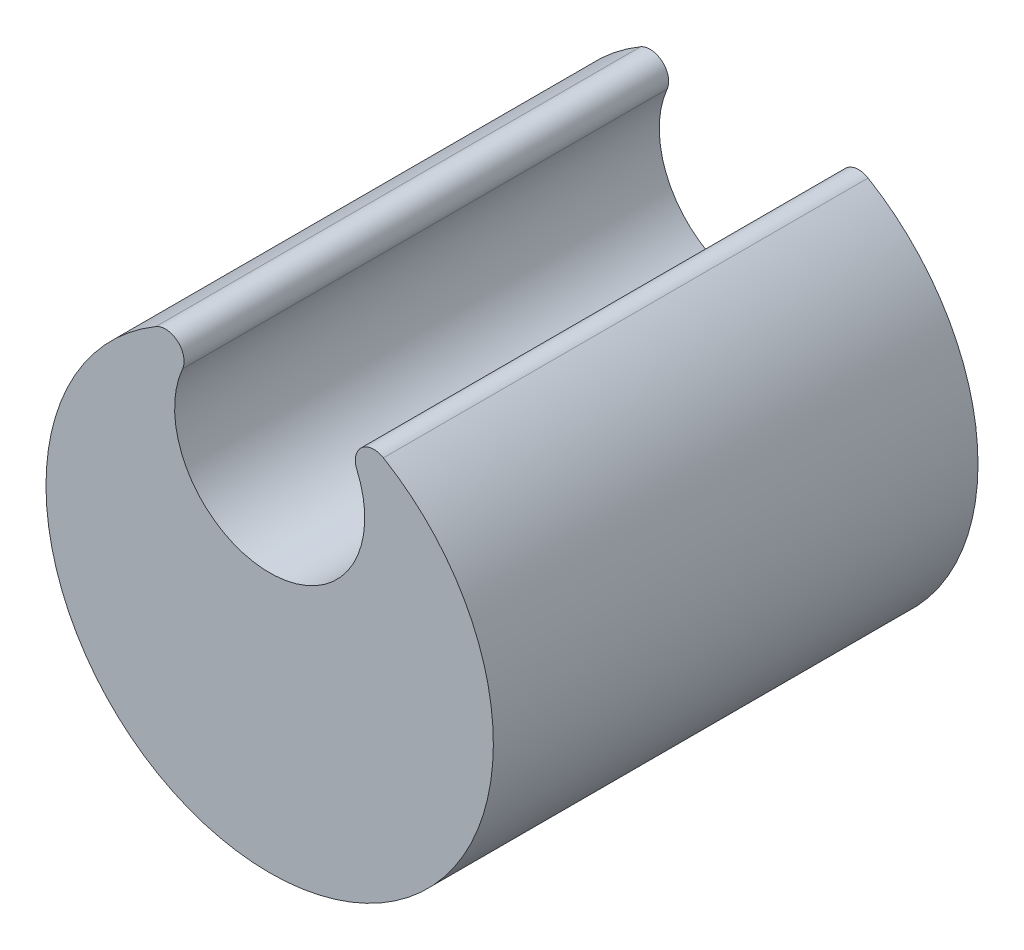
ISO-10303-21;
HEADER;
FILE_DESCRIPTION(('STEP AP214'),'2;1');
FILE_NAME('part.step','',(''),(''),'','','');
FILE_SCHEMA(('AUTOMOTIVE_DESIGN { 1 0 10303 214 1 1 1 1 }'));
ENDSEC;
DATA;
#1=APPLICATION_CONTEXT('core data for automotive mechanical design processes');
#2=APPLICATION_PROTOCOL_DEFINITION('international standard','automotive_design',2000,#1);
#3=PRODUCT_CONTEXT('',#1,'mechanical');
#4=PRODUCT('Part','Part','',(#3));
#5=PRODUCT_RELATED_PRODUCT_CATEGORY('part','',(#4));
#6=PRODUCT_DEFINITION_FORMATION('','',#4);
#7=PRODUCT_DEFINITION_CONTEXT('part definition',#1,'design');
#8=PRODUCT_DEFINITION('design','',#6,#7);
#9=PRODUCT_DEFINITION_SHAPE('','',#8);
#10=(LENGTH_UNIT() NAMED_UNIT(*) SI_UNIT(.MILLI.,.METRE.));
#11=(NAMED_UNIT(*) PLANE_ANGLE_UNIT() SI_UNIT($,.RADIAN.));
#12=(NAMED_UNIT(*) SI_UNIT($,.STERADIAN.) SOLID_ANGLE_UNIT());
#13=UNCERTAINTY_MEASURE_WITH_UNIT(LENGTH_MEASURE(1.E-05),#10,'distance_accuracy_value','');
#14=(GEOMETRIC_REPRESENTATION_CONTEXT(3) GLOBAL_UNCERTAINTY_ASSIGNED_CONTEXT((#13)) GLOBAL_UNIT_ASSIGNED_CONTEXT((#10,
#11,#12)) REPRESENTATION_CONTEXT('',''));
#15=CARTESIAN_POINT('',(0.,0.,0.));
#16=DIRECTION('',(0.,0.,1.));
#17=DIRECTION('',(1.,0.,0.));
#18=AXIS2_PLACEMENT_3D('',#15,#16,#17);
#19=CARTESIAN_POINT('',(0.,0.,13.));
#20=DIRECTION('',(0.,0.,-1.));
#21=DIRECTION('',(-1.,0.,0.));
#22=AXIS2_PLACEMENT_3D('',#19,#20,#21);
#23=CYLINDRICAL_SURFACE('',#22,6.);
#24=CARTESIAN_POINT('',(0.,0.,0.));
#25=DIRECTION('',(0.,0.,1.));
#26=DIRECTION('',(1.,0.,0.));
#27=AXIS2_PLACEMENT_3D('',#24,#25,#26);
#28=CIRCLE('',#27,6.);
#29=CARTESIAN_POINT('',(-3.05147827309755,5.16608946388016,0.));
#30=VERTEX_POINT('',#29);
#31=CARTESIAN_POINT('',(3.05147827309755,5.16608946388016,0.));
#32=VERTEX_POINT('',#31);
#33=EDGE_CURVE('E81',#30,#32,#28,.T.);
#34=ORIENTED_EDGE('',*,*,#33,.T.);
#35=DIRECTION('',(0.,0.,-1.));
#36=VECTOR('',#35,1.);
#37=CARTESIAN_POINT('',(3.05147827309755,5.16608946388016,13.));
#38=LINE('',#37,#36);
#39=CARTESIAN_POINT('',(3.05147827309755,5.16608946388016,13.));
#40=VERTEX_POINT('',#39);
#41=EDGE_CURVE('E51',#32,#40,#38,.F.);
#42=ORIENTED_EDGE('',*,*,#41,.T.);
#43=CARTESIAN_POINT('',(0.,0.,13.));
#44=DIRECTION('',(0.,0.,1.));
#45=DIRECTION('',(1.,0.,0.));
#46=AXIS2_PLACEMENT_3D('',#43,#44,#45);
#47=CIRCLE('',#46,6.);
#48=CARTESIAN_POINT('',(-3.05147827309755,5.16608946388016,13.));
#49=VERTEX_POINT('',#48);
#50=EDGE_CURVE('E96',#49,#40,#47,.T.);
#51=ORIENTED_EDGE('',*,*,#50,.F.);
#52=DIRECTION('',(0.,0.,-1.));
#53=VECTOR('',#52,1.);
#54=CARTESIAN_POINT('',(-3.05147827309755,5.16608946388016,13.));
#55=LINE('',#54,#53);
#56=EDGE_CURVE('E110',#49,#30,#55,.T.);
#57=ORIENTED_EDGE('',*,*,#56,.T.);
#58=EDGE_LOOP('',(#34,#42,#51,#57));
#59=FACE_BOUND('',#58,.T.);
#60=ADVANCED_FACE('F36',(#59),#23,.T.);
#61=CARTESIAN_POINT('',(0.,3.51975432349327,13.));
#62=DIRECTION('',(0.,0.,-1.));
#63=DIRECTION('',(-1.,0.,0.));
#64=AXIS2_PLACEMENT_3D('',#61,#62,#63);
#65=CYLINDRICAL_SURFACE('',#64,2.55);
#66=CARTESIAN_POINT('',(0.,3.51975432349327,13.));
#67=DIRECTION('',(0.,0.,1.));
#68=DIRECTION('',(1.,0.,0.));
#69=AXIS2_PLACEMENT_3D('',#66,#67,#68);
#70=CIRCLE('',#69,2.55);
#71=CARTESIAN_POINT('',(-2.33863293880837,4.53626599461197,13.));
#72=VERTEX_POINT('',#71);
#73=CARTESIAN_POINT('',(2.33863293880837,4.53626599461197,13.));
#74=VERTEX_POINT('',#73);
#75=EDGE_CURVE('E99',#72,#74,#70,.T.);
#76=ORIENTED_EDGE('',*,*,#75,.T.);
#77=DIRECTION('',(0.,0.,-1.));
#78=VECTOR('',#77,1.);
#79=CARTESIAN_POINT('',(2.33863293880837,4.53626599461197,13.));
#80=LINE('',#79,#78);
#81=CARTESIAN_POINT('',(2.33863293880837,4.53626599461197,0.));
#82=VERTEX_POINT('',#81);
#83=EDGE_CURVE('E87',#74,#82,#80,.T.);
#84=ORIENTED_EDGE('',*,*,#83,.T.);
#85=CARTESIAN_POINT('',(0.,3.51975432349327,0.));
#86=DIRECTION('',(0.,0.,1.));
#87=DIRECTION('',(1.,0.,0.));
#88=AXIS2_PLACEMENT_3D('',#85,#86,#87);
#89=CIRCLE('',#88,2.55);
#90=CARTESIAN_POINT('',(-2.33863293880837,4.53626599461197,0.));
#91=VERTEX_POINT('',#90);
#92=EDGE_CURVE('E80',#91,#82,#89,.T.);
#93=ORIENTED_EDGE('',*,*,#92,.F.);
#94=DIRECTION('',(0.,0.,-1.));
#95=VECTOR('',#94,1.);
#96=CARTESIAN_POINT('',(-2.33863293880837,4.53626599461197,13.));
#97=LINE('',#96,#95);
#98=EDGE_CURVE('E93',#91,#72,#97,.F.);
#99=ORIENTED_EDGE('',*,*,#98,.T.);
#100=EDGE_LOOP('',(#76,#84,#93,#99));
#101=FACE_BOUND('',#100,.T.);
#102=ADVANCED_FACE('F92',(#101),#65,.F.);
#103=CARTESIAN_POINT('',(0.,0.,13.));
#104=DIRECTION('',(0.,0.,1.));
#105=DIRECTION('',(1.,0.,0.));
#106=AXIS2_PLACEMENT_3D('',#103,#104,#105);
#107=PLANE('',#106);
#108=ORIENTED_EDGE('',*,*,#50,.T.);
#109=CARTESIAN_POINT('',(2.79718841700609,4.73558200855681,13.));
#110=DIRECTION('',(0.,0.,1.));
#111=DIRECTION('',(1.,0.,0.));
#112=AXIS2_PLACEMENT_3D('',#109,#110,#111);
#113=CIRCLE('',#112,0.5);
#114=EDGE_CURVE('E11',#40,#74,#113,.T.);
#115=ORIENTED_EDGE('',*,*,#114,.T.);
#116=ORIENTED_EDGE('',*,*,#75,.F.);
#117=CARTESIAN_POINT('',(-2.79718841700609,4.73558200855681,13.));
#118=DIRECTION('',(0.,0.,1.));
#119=DIRECTION('',(1.,0.,0.));
#120=AXIS2_PLACEMENT_3D('',#117,#118,#119);
#121=CIRCLE('',#120,0.5);
#122=EDGE_CURVE('E44',#72,#49,#121,.T.);
#123=ORIENTED_EDGE('',*,*,#122,.T.);
#124=EDGE_LOOP('',(#108,#115,#116,#123));
#125=FACE_BOUND('',#124,.T.);
#126=ADVANCED_FACE('F118',(#125),#107,.T.);
#127=CARTESIAN_POINT('',(0.,0.,0.));
#128=DIRECTION('',(0.,0.,1.));
#129=DIRECTION('',(1.,0.,0.));
#130=AXIS2_PLACEMENT_3D('',#127,#128,#129);
#131=PLANE('',#130);
#132=ORIENTED_EDGE('',*,*,#92,.T.);
#133=CARTESIAN_POINT('',(2.79718841700609,4.73558200855681,0.));
#134=DIRECTION('',(0.,0.,1.));
#135=DIRECTION('',(1.,0.,0.));
#136=AXIS2_PLACEMENT_3D('',#133,#134,#135);
#137=CIRCLE('',#136,0.5);
#138=EDGE_CURVE('E86',#82,#32,#137,.F.);
#139=ORIENTED_EDGE('',*,*,#138,.T.);
#140=ORIENTED_EDGE('',*,*,#33,.F.);
#141=CARTESIAN_POINT('',(-2.79718841700609,4.73558200855681,0.));
#142=DIRECTION('',(0.,0.,1.));
#143=DIRECTION('',(1.,0.,0.));
#144=AXIS2_PLACEMENT_3D('',#141,#142,#143);
#145=CIRCLE('',#144,0.5);
#146=EDGE_CURVE('E77',#30,#91,#145,.F.);
#147=ORIENTED_EDGE('',*,*,#146,.T.);
#148=EDGE_LOOP('',(#132,#139,#140,#147));
#149=FACE_BOUND('',#148,.T.);
#150=ADVANCED_FACE('F79',(#149),#131,.F.);
#151=CARTESIAN_POINT('',(2.79718841700609,4.73558200855681,13.));
#152=DIRECTION('',(0.,0.,1.));
#153=DIRECTION('',(1.,0.,0.));
#154=AXIS2_PLACEMENT_3D('',#151,#152,#153);
#155=CYLINDRICAL_SURFACE('',#154,0.5);
#156=ORIENTED_EDGE('',*,*,#114,.F.);
#157=ORIENTED_EDGE('',*,*,#41,.F.);
#158=ORIENTED_EDGE('',*,*,#138,.F.);
#159=ORIENTED_EDGE('',*,*,#83,.F.);
#160=EDGE_LOOP('',(#156,#157,#158,#159));
#161=FACE_BOUND('',#160,.T.);
#162=ADVANCED_FACE('F120',(#161),#155,.T.);
#163=CARTESIAN_POINT('',(-2.79718841700609,4.73558200855681,13.));
#164=DIRECTION('',(0.,0.,1.));
#165=DIRECTION('',(1.,0.,0.));
#166=AXIS2_PLACEMENT_3D('',#163,#164,#165);
#167=CYLINDRICAL_SURFACE('',#166,0.5);
#168=ORIENTED_EDGE('',*,*,#122,.F.);
#169=ORIENTED_EDGE('',*,*,#98,.F.);
#170=ORIENTED_EDGE('',*,*,#146,.F.);
#171=ORIENTED_EDGE('',*,*,#56,.F.);
#172=EDGE_LOOP('',(#168,#169,#170,#171));
#173=FACE_BOUND('',#172,.T.);
#174=ADVANCED_FACE('F38',(#173),#167,.T.);
#175=CLOSED_SHELL('',(#60,#102,#126,#150,#162,#174));
#176=MANIFOLD_SOLID_BREP('B2',#175);
#177=ADVANCED_BREP_SHAPE_REPRESENTATION('',(#18,#176),#14);
#178=SHAPE_DEFINITION_REPRESENTATION(#9,#177);
ENDSEC;
END-ISO-10303-21;
